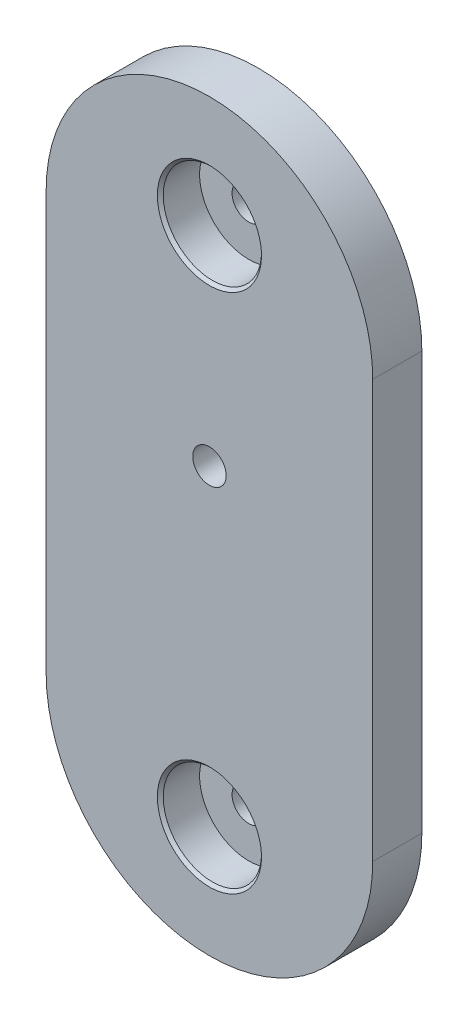
ISO-10303-21;
HEADER;
FILE_DESCRIPTION(('STEP AP214'),'2;1');
FILE_NAME('part.step','',(''),(''),'','','');
FILE_SCHEMA(('AUTOMOTIVE_DESIGN { 1 0 10303 214 1 1 1 1 }'));
ENDSEC;
DATA;
#1=APPLICATION_CONTEXT('core data for automotive mechanical design processes');
#2=APPLICATION_PROTOCOL_DEFINITION('international standard','automotive_design',2000,#1);
#3=PRODUCT_CONTEXT('',#1,'mechanical');
#4=PRODUCT('Part','Part','',(#3));
#5=PRODUCT_RELATED_PRODUCT_CATEGORY('part','',(#4));
#6=PRODUCT_DEFINITION_FORMATION('','',#4);
#7=PRODUCT_DEFINITION_CONTEXT('part definition',#1,'design');
#8=PRODUCT_DEFINITION('design','',#6,#7);
#9=PRODUCT_DEFINITION_SHAPE('','',#8);
#10=(LENGTH_UNIT() NAMED_UNIT(*) SI_UNIT(.MILLI.,.METRE.));
#11=(NAMED_UNIT(*) PLANE_ANGLE_UNIT() SI_UNIT($,.RADIAN.));
#12=(NAMED_UNIT(*) SI_UNIT($,.STERADIAN.) SOLID_ANGLE_UNIT());
#13=UNCERTAINTY_MEASURE_WITH_UNIT(LENGTH_MEASURE(1.E-05),#10,'distance_accuracy_value','');
#14=(GEOMETRIC_REPRESENTATION_CONTEXT(3) GLOBAL_UNCERTAINTY_ASSIGNED_CONTEXT((#13)) GLOBAL_UNIT_ASSIGNED_CONTEXT((#10,
#11,#12)) REPRESENTATION_CONTEXT('',''));
#15=CARTESIAN_POINT('',(0.,0.,0.));
#16=DIRECTION('',(0.,0.,1.));
#17=DIRECTION('',(1.,0.,0.));
#18=AXIS2_PLACEMENT_3D('',#15,#16,#17);
#19=CARTESIAN_POINT('',(0.,26.5125,5.));
#20=DIRECTION('',(0.,0.,-1.));
#21=DIRECTION('',(-1.,0.,0.));
#22=AXIS2_PLACEMENT_3D('',#19,#20,#21);
#23=CYLINDRICAL_SURFACE('',#22,1.7);
#24=CARTESIAN_POINT('',(0.,26.5125,0.));
#25=DIRECTION('',(0.,0.,1.));
#26=DIRECTION('',(1.,0.,0.));
#27=AXIS2_PLACEMENT_3D('',#24,#25,#26);
#28=CIRCLE('',#27,1.7);
#29=CARTESIAN_POINT('',(1.69999999999999,26.5125,0.));
#30=VERTEX_POINT('',#29);
#31=EDGE_CURVE('E109',#30,#30,#28,.T.);
#32=ORIENTED_EDGE('',*,*,#31,.F.);
#33=EDGE_LOOP('',(#32));
#34=FACE_BOUND('',#33,.T.);
#35=CARTESIAN_POINT('',(0.,26.5125,1.));
#36=DIRECTION('',(0.,0.,1.));
#37=DIRECTION('',(1.,0.,0.));
#38=AXIS2_PLACEMENT_3D('',#35,#36,#37);
#39=CIRCLE('',#38,1.7);
#40=CARTESIAN_POINT('',(1.69999999999999,26.5125,1.));
#41=VERTEX_POINT('',#40);
#42=EDGE_CURVE('E120',#41,#41,#39,.T.);
#43=ORIENTED_EDGE('',*,*,#42,.T.);
#44=EDGE_LOOP('',(#43));
#45=FACE_BOUND('',#44,.T.);
#46=ADVANCED_FACE('F37',(#34,#45),#23,.F.);
#47=CARTESIAN_POINT('',(0.,-26.5125,5.));
#48=DIRECTION('',(0.,0.,-1.));
#49=DIRECTION('',(-1.,0.,0.));
#50=AXIS2_PLACEMENT_3D('',#47,#48,#49);
#51=CYLINDRICAL_SURFACE('',#50,1.7);
#52=CARTESIAN_POINT('',(0.,-26.5125,0.));
#53=DIRECTION('',(0.,0.,1.));
#54=DIRECTION('',(1.,0.,0.));
#55=AXIS2_PLACEMENT_3D('',#52,#53,#54);
#56=CIRCLE('',#55,1.7);
#57=CARTESIAN_POINT('',(1.70000000000001,-26.5125,0.));
#58=VERTEX_POINT('',#57);
#59=EDGE_CURVE('E124',#58,#58,#56,.T.);
#60=ORIENTED_EDGE('',*,*,#59,.F.);
#61=EDGE_LOOP('',(#60));
#62=FACE_BOUND('',#61,.T.);
#63=CARTESIAN_POINT('',(0.,-26.5125,1.));
#64=DIRECTION('',(0.,0.,1.));
#65=DIRECTION('',(1.,0.,0.));
#66=AXIS2_PLACEMENT_3D('',#63,#64,#65);
#67=CIRCLE('',#66,1.7);
#68=CARTESIAN_POINT('',(1.70000000000001,-26.5125,1.));
#69=VERTEX_POINT('',#68);
#70=EDGE_CURVE('E117',#69,#69,#67,.T.);
#71=ORIENTED_EDGE('',*,*,#70,.T.);
#72=EDGE_LOOP('',(#71));
#73=FACE_BOUND('',#72,.T.);
#74=ADVANCED_FACE('F168',(#62,#73),#51,.F.);
#75=CARTESIAN_POINT('',(0.,-21.2525,5.));
#76=DIRECTION('',(0.,0.,-1.));
#77=DIRECTION('',(-1.,0.,0.));
#78=AXIS2_PLACEMENT_3D('',#75,#76,#77);
#79=PLANE('',#78);
#80=CARTESIAN_POINT('',(0.,-26.5125,5.));
#81=DIRECTION('',(0.,0.,-1.));
#82=DIRECTION('',(-1.,0.,0.));
#83=AXIS2_PLACEMENT_3D('',#80,#81,#82);
#84=CIRCLE('',#83,5.29999999999997);
#85=CARTESIAN_POINT('',(-5.29999999999997,-26.5125,5.));
#86=VERTEX_POINT('',#85);
#87=EDGE_CURVE('E47',#86,#86,#84,.T.);
#88=ORIENTED_EDGE('',*,*,#87,.T.);
#89=EDGE_LOOP('',(#88));
#90=FACE_BOUND('',#89,.T.);
#91=CARTESIAN_POINT('',(0.,26.5125,5.));
#92=DIRECTION('',(0.,0.,-1.));
#93=DIRECTION('',(-1.,0.,0.));
#94=AXIS2_PLACEMENT_3D('',#91,#92,#93);
#95=CIRCLE('',#94,5.29999999999997);
#96=CARTESIAN_POINT('',(-5.29999999999998,26.5125,5.));
#97=VERTEX_POINT('',#96);
#98=EDGE_CURVE('E127',#97,#97,#95,.T.);
#99=ORIENTED_EDGE('',*,*,#98,.T.);
#100=EDGE_LOOP('',(#99));
#101=FACE_BOUND('',#100,.T.);
#102=CARTESIAN_POINT('',(0.,5.3025,5.));
#103=DIRECTION('',(0.,0.,1.));
#104=DIRECTION('',(1.,0.,0.));
#105=AXIS2_PLACEMENT_3D('',#102,#103,#104);
#106=CIRCLE('',#105,1.7);
#107=CARTESIAN_POINT('',(1.7,5.3025,5.));
#108=VERTEX_POINT('',#107);
#109=EDGE_CURVE('E150',#108,#108,#106,.T.);
#110=ORIENTED_EDGE('',*,*,#109,.F.);
#111=EDGE_LOOP('',(#110));
#112=FACE_BOUND('',#111,.T.);
#113=CARTESIAN_POINT('',(0.,-21.2525,5.));
#114=DIRECTION('',(0.,0.,1.));
#115=DIRECTION('',(-1.,0.,0.));
#116=AXIS2_PLACEMENT_3D('',#113,#114,#115);
#117=CIRCLE('',#116,16.6225);
#118=CARTESIAN_POINT('',(-16.6225,-21.2525,5.));
#119=VERTEX_POINT('',#118);
#120=CARTESIAN_POINT('',(16.6225,-21.2525,5.));
#121=VERTEX_POINT('',#120);
#122=EDGE_CURVE('E91',#119,#121,#117,.T.);
#123=ORIENTED_EDGE('',*,*,#122,.T.);
#124=DIRECTION('',(0.,1.,0.));
#125=VECTOR('',#124,1.);
#126=CARTESIAN_POINT('',(16.6225,21.2525,5.));
#127=LINE('',#126,#125);
#128=CARTESIAN_POINT('',(16.6225,21.2525,5.));
#129=VERTEX_POINT('',#128);
#130=EDGE_CURVE('E86',#121,#129,#127,.T.);
#131=ORIENTED_EDGE('',*,*,#130,.T.);
#132=CARTESIAN_POINT('',(0.,21.2525,5.));
#133=DIRECTION('',(0.,0.,1.));
#134=DIRECTION('',(-1.,0.,0.));
#135=AXIS2_PLACEMENT_3D('',#132,#133,#134);
#136=CIRCLE('',#135,16.6225);
#137=CARTESIAN_POINT('',(-16.6225,21.2525,5.));
#138=VERTEX_POINT('',#137);
#139=EDGE_CURVE('E89',#129,#138,#136,.T.);
#140=ORIENTED_EDGE('',*,*,#139,.T.);
#141=DIRECTION('',(0.,-1.,0.));
#142=VECTOR('',#141,1.);
#143=CARTESIAN_POINT('',(-16.6225,-21.2525,5.));
#144=LINE('',#143,#142);
#145=EDGE_CURVE('E55',#138,#119,#144,.T.);
#146=ORIENTED_EDGE('',*,*,#145,.T.);
#147=EDGE_LOOP('',(#123,#131,#140,#146));
#148=FACE_BOUND('',#147,.T.);
#149=ADVANCED_FACE('F87',(#90,#101,#112,#148),#79,.F.);
#150=CARTESIAN_POINT('',(0.,-21.2525,0.));
#151=DIRECTION('',(0.,0.,-1.));
#152=DIRECTION('',(-1.,0.,0.));
#153=AXIS2_PLACEMENT_3D('',#150,#151,#152);
#154=PLANE('',#153);
#155=CARTESIAN_POINT('',(0.,5.3025,0.));
#156=DIRECTION('',(0.,0.,1.));
#157=DIRECTION('',(1.,0.,0.));
#158=AXIS2_PLACEMENT_3D('',#155,#156,#157);
#159=CIRCLE('',#158,3.);
#160=CARTESIAN_POINT('',(3.,5.3025,0.));
#161=VERTEX_POINT('',#160);
#162=EDGE_CURVE('E329',#161,#161,#159,.T.);
#163=ORIENTED_EDGE('',*,*,#162,.T.);
#164=EDGE_LOOP('',(#163));
#165=FACE_BOUND('',#164,.T.);
#166=ORIENTED_EDGE('',*,*,#31,.T.);
#167=EDGE_LOOP('',(#166));
#168=FACE_BOUND('',#167,.T.);
#169=CARTESIAN_POINT('',(0.,-21.2525,0.));
#170=DIRECTION('',(0.,0.,1.));
#171=DIRECTION('',(-1.,0.,0.));
#172=AXIS2_PLACEMENT_3D('',#169,#170,#171);
#173=CIRCLE('',#172,16.6225);
#174=CARTESIAN_POINT('',(-16.6225,-21.2525,0.));
#175=VERTEX_POINT('',#174);
#176=CARTESIAN_POINT('',(16.6225,-21.2525,0.));
#177=VERTEX_POINT('',#176);
#178=EDGE_CURVE('E106',#175,#177,#173,.T.);
#179=ORIENTED_EDGE('',*,*,#178,.F.);
#180=DIRECTION('',(0.,-1.,0.));
#181=VECTOR('',#180,1.);
#182=CARTESIAN_POINT('',(-16.6225,-21.2525,0.));
#183=LINE('',#182,#181);
#184=CARTESIAN_POINT('',(-16.6225,21.2525,0.));
#185=VERTEX_POINT('',#184);
#186=EDGE_CURVE('E78',#185,#175,#183,.T.);
#187=ORIENTED_EDGE('',*,*,#186,.F.);
#188=CARTESIAN_POINT('',(0.,21.2525,0.));
#189=DIRECTION('',(0.,0.,1.));
#190=DIRECTION('',(-1.,0.,0.));
#191=AXIS2_PLACEMENT_3D('',#188,#189,#190);
#192=CIRCLE('',#191,16.6225);
#193=CARTESIAN_POINT('',(16.6225,21.2525,0.));
#194=VERTEX_POINT('',#193);
#195=EDGE_CURVE('E72',#194,#185,#192,.T.);
#196=ORIENTED_EDGE('',*,*,#195,.F.);
#197=DIRECTION('',(0.,1.,0.));
#198=VECTOR('',#197,1.);
#199=CARTESIAN_POINT('',(16.6225,21.2525,0.));
#200=LINE('',#199,#198);
#201=EDGE_CURVE('E96',#177,#194,#200,.T.);
#202=ORIENTED_EDGE('',*,*,#201,.F.);
#203=EDGE_LOOP('',(#179,#187,#196,#202));
#204=FACE_BOUND('',#203,.T.);
#205=ORIENTED_EDGE('',*,*,#59,.T.);
#206=EDGE_LOOP('',(#205));
#207=FACE_BOUND('',#206,.T.);
#208=ADVANCED_FACE('F163',(#165,#168,#204,#207),#154,.T.);
#209=CARTESIAN_POINT('',(0.,-21.2525,5.));
#210=DIRECTION('',(0.,0.,-1.));
#211=DIRECTION('',(-1.,0.,0.));
#212=AXIS2_PLACEMENT_3D('',#209,#210,#211);
#213=CYLINDRICAL_SURFACE('',#212,16.6225);
#214=ORIENTED_EDGE('',*,*,#178,.T.);
#215=DIRECTION('',(0.,0.,-1.));
#216=VECTOR('',#215,1.);
#217=CARTESIAN_POINT('',(16.6225,-21.2525,5.));
#218=LINE('',#217,#216);
#219=EDGE_CURVE('E97',#121,#177,#218,.T.);
#220=ORIENTED_EDGE('',*,*,#219,.F.);
#221=ORIENTED_EDGE('',*,*,#122,.F.);
#222=DIRECTION('',(0.,0.,-1.));
#223=VECTOR('',#222,1.);
#224=CARTESIAN_POINT('',(-16.6225,-21.2525,5.));
#225=LINE('',#224,#223);
#226=EDGE_CURVE('E102',#119,#175,#225,.T.);
#227=ORIENTED_EDGE('',*,*,#226,.T.);
#228=EDGE_LOOP('',(#214,#220,#221,#227));
#229=FACE_BOUND('',#228,.T.);
#230=ADVANCED_FACE('F197',(#229),#213,.T.);
#231=CARTESIAN_POINT('',(16.6225,21.2525,5.));
#232=DIRECTION('',(-1.,0.,0.));
#233=DIRECTION('',(0.,-1.,0.));
#234=AXIS2_PLACEMENT_3D('',#231,#232,#233);
#235=PLANE('',#234);
#236=ORIENTED_EDGE('',*,*,#201,.T.);
#237=DIRECTION('',(0.,0.,-1.));
#238=VECTOR('',#237,1.);
#239=CARTESIAN_POINT('',(16.6225,21.2525,5.));
#240=LINE('',#239,#238);
#241=EDGE_CURVE('E94',#129,#194,#240,.T.);
#242=ORIENTED_EDGE('',*,*,#241,.F.);
#243=ORIENTED_EDGE('',*,*,#130,.F.);
#244=ORIENTED_EDGE('',*,*,#219,.T.);
#245=EDGE_LOOP('',(#236,#242,#243,#244));
#246=FACE_BOUND('',#245,.T.);
#247=ADVANCED_FACE('F95',(#246),#235,.F.);
#248=CARTESIAN_POINT('',(0.,21.2525,5.));
#249=DIRECTION('',(0.,0.,-1.));
#250=DIRECTION('',(-1.,0.,0.));
#251=AXIS2_PLACEMENT_3D('',#248,#249,#250);
#252=CYLINDRICAL_SURFACE('',#251,16.6225);
#253=ORIENTED_EDGE('',*,*,#195,.T.);
#254=DIRECTION('',(0.,0.,-1.));
#255=VECTOR('',#254,1.);
#256=CARTESIAN_POINT('',(-16.6225,21.2525,5.));
#257=LINE('',#256,#255);
#258=EDGE_CURVE('E98',#138,#185,#257,.T.);
#259=ORIENTED_EDGE('',*,*,#258,.F.);
#260=ORIENTED_EDGE('',*,*,#139,.F.);
#261=ORIENTED_EDGE('',*,*,#241,.T.);
#262=EDGE_LOOP('',(#253,#259,#260,#261));
#263=FACE_BOUND('',#262,.T.);
#264=ADVANCED_FACE('F100',(#263),#252,.T.);
#265=CARTESIAN_POINT('',(-16.6225,-21.2525,5.));
#266=DIRECTION('',(1.,0.,0.));
#267=DIRECTION('',(0.,1.,0.));
#268=AXIS2_PLACEMENT_3D('',#265,#266,#267);
#269=PLANE('',#268);
#270=ORIENTED_EDGE('',*,*,#186,.T.);
#271=ORIENTED_EDGE('',*,*,#226,.F.);
#272=ORIENTED_EDGE('',*,*,#145,.F.);
#273=ORIENTED_EDGE('',*,*,#258,.T.);
#274=EDGE_LOOP('',(#270,#271,#272,#273));
#275=FACE_BOUND('',#274,.T.);
#276=ADVANCED_FACE('F144',(#275),#269,.F.);
#277=CARTESIAN_POINT('',(0.,-26.5125,1.));
#278=DIRECTION('',(0.,0.,1.));
#279=DIRECTION('',(1.,0.,0.));
#280=AXIS2_PLACEMENT_3D('',#277,#278,#279);
#281=CYLINDRICAL_SURFACE('',#280,5.);
#282=CARTESIAN_POINT('',(0.,-26.5125,4.70000000000003));
#283=DIRECTION('',(0.,0.,-1.));
#284=DIRECTION('',(-1.,0.,0.));
#285=AXIS2_PLACEMENT_3D('',#282,#283,#284);
#286=CIRCLE('',#285,5.);
#287=CARTESIAN_POINT('',(-5.,-26.5125,4.70000000000003));
#288=VERTEX_POINT('',#287);
#289=EDGE_CURVE('E116',#288,#288,#286,.F.);
#290=ORIENTED_EDGE('',*,*,#289,.T.);
#291=EDGE_LOOP('',(#290));
#292=FACE_BOUND('',#291,.T.);
#293=CARTESIAN_POINT('',(0.,-26.5125,1.));
#294=DIRECTION('',(0.,0.,1.));
#295=DIRECTION('',(1.,0.,0.));
#296=AXIS2_PLACEMENT_3D('',#293,#294,#295);
#297=CIRCLE('',#296,5.);
#298=CARTESIAN_POINT('',(5.00000000000001,-26.5125,1.));
#299=VERTEX_POINT('',#298);
#300=EDGE_CURVE('E148',#299,#299,#297,.T.);
#301=ORIENTED_EDGE('',*,*,#300,.F.);
#302=EDGE_LOOP('',(#301));
#303=FACE_BOUND('',#302,.T.);
#304=ADVANCED_FACE('F140',(#292,#303),#281,.F.);
#305=CARTESIAN_POINT('',(0.,-26.5125,1.));
#306=DIRECTION('',(0.,0.,1.));
#307=DIRECTION('',(1.,0.,0.));
#308=AXIS2_PLACEMENT_3D('',#305,#306,#307);
#309=PLANE('',#308);
#310=ORIENTED_EDGE('',*,*,#70,.F.);
#311=EDGE_LOOP('',(#310));
#312=FACE_BOUND('',#311,.T.);
#313=ORIENTED_EDGE('',*,*,#300,.T.);
#314=EDGE_LOOP('',(#313));
#315=FACE_BOUND('',#314,.T.);
#316=ADVANCED_FACE('F143',(#312,#315),#309,.T.);
#317=CARTESIAN_POINT('',(0.,26.5125,1.));
#318=DIRECTION('',(0.,0.,1.));
#319=DIRECTION('',(1.,0.,0.));
#320=AXIS2_PLACEMENT_3D('',#317,#318,#319);
#321=CYLINDRICAL_SURFACE('',#320,5.);
#322=CARTESIAN_POINT('',(0.,26.5125,4.70000000000003));
#323=DIRECTION('',(0.,0.,-1.));
#324=DIRECTION('',(-1.,0.,0.));
#325=AXIS2_PLACEMENT_3D('',#322,#323,#324);
#326=CIRCLE('',#325,5.);
#327=CARTESIAN_POINT('',(-5.00000000000002,26.5125,4.70000000000003));
#328=VERTEX_POINT('',#327);
#329=EDGE_CURVE('E11',#328,#328,#326,.F.);
#330=ORIENTED_EDGE('',*,*,#329,.T.);
#331=EDGE_LOOP('',(#330));
#332=FACE_BOUND('',#331,.T.);
#333=CARTESIAN_POINT('',(0.,26.5125,1.));
#334=DIRECTION('',(0.,0.,1.));
#335=DIRECTION('',(1.,0.,0.));
#336=AXIS2_PLACEMENT_3D('',#333,#334,#335);
#337=CIRCLE('',#336,5.);
#338=CARTESIAN_POINT('',(4.99999999999999,26.5125,1.));
#339=VERTEX_POINT('',#338);
#340=EDGE_CURVE('E121',#339,#339,#337,.T.);
#341=ORIENTED_EDGE('',*,*,#340,.F.);
#342=EDGE_LOOP('',(#341));
#343=FACE_BOUND('',#342,.T.);
#344=ADVANCED_FACE('F176',(#332,#343),#321,.F.);
#345=CARTESIAN_POINT('',(0.,26.5125,1.));
#346=DIRECTION('',(0.,0.,1.));
#347=DIRECTION('',(1.,0.,0.));
#348=AXIS2_PLACEMENT_3D('',#345,#346,#347);
#349=PLANE('',#348);
#350=ORIENTED_EDGE('',*,*,#42,.F.);
#351=EDGE_LOOP('',(#350));
#352=FACE_BOUND('',#351,.T.);
#353=ORIENTED_EDGE('',*,*,#340,.T.);
#354=EDGE_LOOP('',(#353));
#355=FACE_BOUND('',#354,.T.);
#356=ADVANCED_FACE('F172',(#352,#355),#349,.T.);
#357=CARTESIAN_POINT('',(0.,5.3025,13.6129439695325));
#358=DIRECTION('',(0.,0.,1.));
#359=DIRECTION('',(1.,0.,0.));
#360=AXIS2_PLACEMENT_3D('',#357,#358,#359);
#361=CYLINDRICAL_SURFACE('',#360,1.7);
#362=CARTESIAN_POINT('',(0.,5.3025,1.3));
#363=DIRECTION('',(0.,0.,1.));
#364=DIRECTION('',(1.,0.,0.));
#365=AXIS2_PLACEMENT_3D('',#362,#363,#364);
#366=CIRCLE('',#365,1.7);
#367=CARTESIAN_POINT('',(1.7,5.3025,1.3));
#368=VERTEX_POINT('',#367);
#369=EDGE_CURVE('E155',#368,#368,#366,.T.);
#370=ORIENTED_EDGE('',*,*,#369,.F.);
#371=EDGE_LOOP('',(#370));
#372=FACE_BOUND('',#371,.T.);
#373=ORIENTED_EDGE('',*,*,#109,.T.);
#374=EDGE_LOOP('',(#373));
#375=FACE_BOUND('',#374,.T.);
#376=ADVANCED_FACE('F175',(#372,#375),#361,.F.);
#377=CARTESIAN_POINT('',(0.,5.3025,1.3));
#378=DIRECTION('',(0.,0.,-1.));
#379=DIRECTION('',(-1.,0.,0.));
#380=AXIS2_PLACEMENT_3D('',#377,#378,#379);
#381=CONICAL_SURFACE('',#380,1.7,0.78539816339745);
#382=ORIENTED_EDGE('',*,*,#162,.F.);
#383=EDGE_LOOP('',(#382));
#384=FACE_BOUND('',#383,.T.);
#385=ORIENTED_EDGE('',*,*,#369,.T.);
#386=EDGE_LOOP('',(#385));
#387=FACE_BOUND('',#386,.T.);
#388=ADVANCED_FACE('F137',(#384,#387),#381,.F.);
#389=CARTESIAN_POINT('',(0.,-26.5125,4.70000000000003));
#390=DIRECTION('',(0.,0.,1.));
#391=DIRECTION('',(1.,0.,0.));
#392=AXIS2_PLACEMENT_3D('',#389,#390,#391);
#393=CONICAL_SURFACE('',#392,5.,0.785398163397441);
#394=ORIENTED_EDGE('',*,*,#87,.F.);
#395=EDGE_LOOP('',(#394));
#396=FACE_BOUND('',#395,.T.);
#397=ORIENTED_EDGE('',*,*,#289,.F.);
#398=EDGE_LOOP('',(#397));
#399=FACE_BOUND('',#398,.T.);
#400=ADVANCED_FACE('F134',(#396,#399),#393,.F.);
#401=CARTESIAN_POINT('',(0.,26.5125,4.70000000000003));
#402=DIRECTION('',(0.,0.,1.));
#403=DIRECTION('',(1.,0.,0.));
#404=AXIS2_PLACEMENT_3D('',#401,#402,#403);
#405=CONICAL_SURFACE('',#404,5.,0.785398163397441);
#406=ORIENTED_EDGE('',*,*,#98,.F.);
#407=EDGE_LOOP('',(#406));
#408=FACE_BOUND('',#407,.T.);
#409=ORIENTED_EDGE('',*,*,#329,.F.);
#410=EDGE_LOOP('',(#409));
#411=FACE_BOUND('',#410,.T.);
#412=ADVANCED_FACE('F40',(#408,#411),#405,.F.);
#413=CLOSED_SHELL('',(#46,#74,#149,#208,#230,#247,#264,#276,#304,#316,#344,#356,#376,#388,#400,#412));
#414=MANIFOLD_SOLID_BREP('B2',#413);
#415=ADVANCED_BREP_SHAPE_REPRESENTATION('',(#18,#414),#14);
#416=SHAPE_DEFINITION_REPRESENTATION(#9,#415);
ENDSEC;
END-ISO-10303-21;
